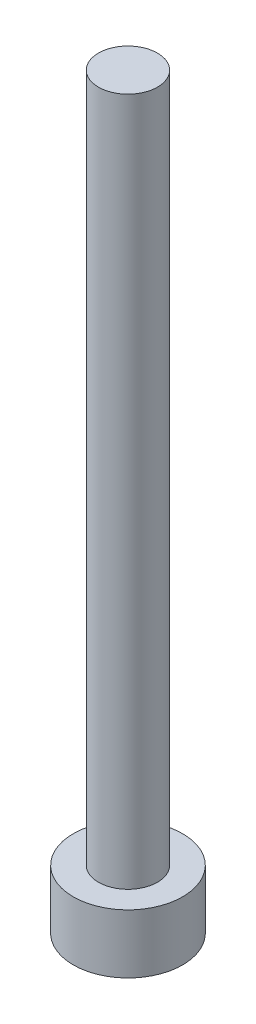
ISO-10303-21;
HEADER;
FILE_DESCRIPTION(('STEP AP214'),'2;1');
FILE_NAME('part.step','',(''),(''),'','','');
FILE_SCHEMA(('AUTOMOTIVE_DESIGN { 1 0 10303 214 1 1 1 1 }'));
ENDSEC;
DATA;
#1=APPLICATION_CONTEXT('core data for automotive mechanical design processes');
#2=APPLICATION_PROTOCOL_DEFINITION('international standard','automotive_design',2000,#1);
#3=PRODUCT_CONTEXT('',#1,'mechanical');
#4=PRODUCT('Part','Part','',(#3));
#5=PRODUCT_RELATED_PRODUCT_CATEGORY('part','',(#4));
#6=PRODUCT_DEFINITION_FORMATION('','',#4);
#7=PRODUCT_DEFINITION_CONTEXT('part definition',#1,'design');
#8=PRODUCT_DEFINITION('design','',#6,#7);
#9=PRODUCT_DEFINITION_SHAPE('','',#8);
#10=(LENGTH_UNIT() NAMED_UNIT(*) SI_UNIT(.MILLI.,.METRE.));
#11=(NAMED_UNIT(*) PLANE_ANGLE_UNIT() SI_UNIT($,.RADIAN.));
#12=(NAMED_UNIT(*) SI_UNIT($,.STERADIAN.) SOLID_ANGLE_UNIT());
#13=UNCERTAINTY_MEASURE_WITH_UNIT(LENGTH_MEASURE(1.E-05),#10,'distance_accuracy_value','');
#14=(GEOMETRIC_REPRESENTATION_CONTEXT(3) GLOBAL_UNCERTAINTY_ASSIGNED_CONTEXT((#13)) GLOBAL_UNIT_ASSIGNED_CONTEXT((#10,
#11,#12)) REPRESENTATION_CONTEXT('',''));
#15=CARTESIAN_POINT('',(0.,0.,0.));
#16=DIRECTION('',(0.,0.,1.));
#17=DIRECTION('',(1.,0.,0.));
#18=AXIS2_PLACEMENT_3D('',#15,#16,#17);
#19=CARTESIAN_POINT('',(0.,3.,0.));
#20=DIRECTION('',(0.,-1.,0.));
#21=DIRECTION('',(0.,0.,-1.));
#22=AXIS2_PLACEMENT_3D('',#19,#20,#21);
#23=CYLINDRICAL_SURFACE('',#22,2.78);
#24=CARTESIAN_POINT('',(0.,3.,0.));
#25=DIRECTION('',(0.,1.,0.));
#26=DIRECTION('',(0.,0.,1.));
#27=AXIS2_PLACEMENT_3D('',#24,#25,#26);
#28=CIRCLE('',#27,2.78);
#29=CARTESIAN_POINT('',(0.,3.,2.78));
#30=VERTEX_POINT('',#29);
#31=EDGE_CURVE('E10',#30,#30,#28,.T.);
#32=ORIENTED_EDGE('',*,*,#31,.F.);
#33=EDGE_LOOP('',(#32));
#34=FACE_BOUND('',#33,.T.);
#35=CARTESIAN_POINT('',(0.,0.,0.));
#36=DIRECTION('',(0.,1.,0.));
#37=DIRECTION('',(0.,0.,1.));
#38=AXIS2_PLACEMENT_3D('',#35,#36,#37);
#39=CIRCLE('',#38,2.78);
#40=CARTESIAN_POINT('',(0.,0.,2.78));
#41=VERTEX_POINT('',#40);
#42=EDGE_CURVE('E34',#41,#41,#39,.T.);
#43=ORIENTED_EDGE('',*,*,#42,.T.);
#44=EDGE_LOOP('',(#43));
#45=FACE_BOUND('',#44,.T.);
#46=ADVANCED_FACE('F31',(#34,#45),#23,.T.);
#47=CARTESIAN_POINT('',(0.,3.,0.));
#48=DIRECTION('',(0.,1.,0.));
#49=DIRECTION('',(0.,0.,1.));
#50=AXIS2_PLACEMENT_3D('',#47,#48,#49);
#51=PLANE('',#50);
#52=CARTESIAN_POINT('',(0.,3.,0.));
#53=DIRECTION('',(0.,1.,0.));
#54=DIRECTION('',(0.,0.,1.));
#55=AXIS2_PLACEMENT_3D('',#52,#53,#54);
#56=CIRCLE('',#55,1.5);
#57=CARTESIAN_POINT('',(0.,3.,1.5));
#58=VERTEX_POINT('',#57);
#59=EDGE_CURVE('E43',#58,#58,#56,.T.);
#60=ORIENTED_EDGE('',*,*,#59,.F.);
#61=EDGE_LOOP('',(#60));
#62=FACE_BOUND('',#61,.T.);
#63=ORIENTED_EDGE('',*,*,#31,.T.);
#64=EDGE_LOOP('',(#63));
#65=FACE_BOUND('',#64,.T.);
#66=ADVANCED_FACE('F58',(#62,#65),#51,.T.);
#67=CARTESIAN_POINT('',(0.,0.,0.));
#68=DIRECTION('',(0.,1.,0.));
#69=DIRECTION('',(0.,0.,1.));
#70=AXIS2_PLACEMENT_3D('',#67,#68,#69);
#71=PLANE('',#70);
#72=ORIENTED_EDGE('',*,*,#42,.F.);
#73=EDGE_LOOP('',(#72));
#74=FACE_BOUND('',#73,.T.);
#75=ADVANCED_FACE('F54',(#74),#71,.F.);
#76=CARTESIAN_POINT('',(0.,38.,0.));
#77=DIRECTION('',(0.,-1.,0.));
#78=DIRECTION('',(0.,0.,-1.));
#79=AXIS2_PLACEMENT_3D('',#76,#77,#78);
#80=CYLINDRICAL_SURFACE('',#79,1.5);
#81=CARTESIAN_POINT('',(0.,38.,0.));
#82=DIRECTION('',(0.,1.,0.));
#83=DIRECTION('',(0.,0.,1.));
#84=AXIS2_PLACEMENT_3D('',#81,#82,#83);
#85=CIRCLE('',#84,1.5);
#86=CARTESIAN_POINT('',(0.,38.,1.5));
#87=VERTEX_POINT('',#86);
#88=EDGE_CURVE('E41',#87,#87,#85,.T.);
#89=ORIENTED_EDGE('',*,*,#88,.F.);
#90=EDGE_LOOP('',(#89));
#91=FACE_BOUND('',#90,.T.);
#92=ORIENTED_EDGE('',*,*,#59,.T.);
#93=EDGE_LOOP('',(#92));
#94=FACE_BOUND('',#93,.T.);
#95=ADVANCED_FACE('F51',(#91,#94),#80,.T.);
#96=CARTESIAN_POINT('',(0.,38.,0.));
#97=DIRECTION('',(0.,1.,0.));
#98=DIRECTION('',(0.,0.,1.));
#99=AXIS2_PLACEMENT_3D('',#96,#97,#98);
#100=PLANE('',#99);
#101=ORIENTED_EDGE('',*,*,#88,.T.);
#102=EDGE_LOOP('',(#101));
#103=FACE_BOUND('',#102,.T.);
#104=ADVANCED_FACE('F49',(#103),#100,.T.);
#105=CLOSED_SHELL('',(#46,#66,#75,#95,#104));
#106=MANIFOLD_SOLID_BREP('B2',#105);
#107=ADVANCED_BREP_SHAPE_REPRESENTATION('',(#18,#106),#14);
#108=SHAPE_DEFINITION_REPRESENTATION(#9,#107);
ENDSEC;
END-ISO-10303-21;
